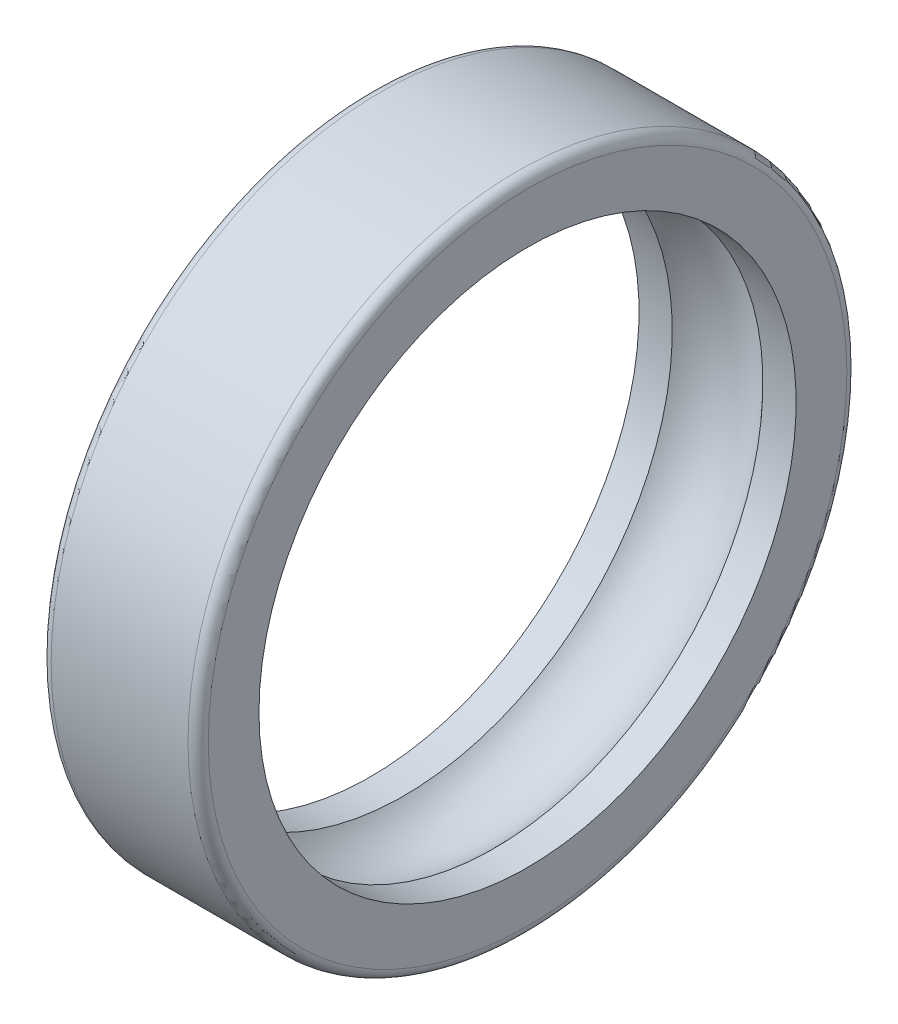
ISO-10303-21;
HEADER;
FILE_DESCRIPTION(('STEP AP214'),'2;1');
FILE_NAME('part.step','',(''),(''),'','','');
FILE_SCHEMA(('AUTOMOTIVE_DESIGN { 1 0 10303 214 1 1 1 1 }'));
ENDSEC;
DATA;
#1=APPLICATION_CONTEXT('core data for automotive mechanical design processes');
#2=APPLICATION_PROTOCOL_DEFINITION('international standard','automotive_design',2000,#1);
#3=PRODUCT_CONTEXT('',#1,'mechanical');
#4=PRODUCT('Part','Part','',(#3));
#5=PRODUCT_RELATED_PRODUCT_CATEGORY('part','',(#4));
#6=PRODUCT_DEFINITION_FORMATION('','',#4);
#7=PRODUCT_DEFINITION_CONTEXT('part definition',#1,'design');
#8=PRODUCT_DEFINITION('design','',#6,#7);
#9=PRODUCT_DEFINITION_SHAPE('','',#8);
#10=(LENGTH_UNIT() NAMED_UNIT(*) SI_UNIT(.MILLI.,.METRE.));
#11=(NAMED_UNIT(*) PLANE_ANGLE_UNIT() SI_UNIT($,.RADIAN.));
#12=(NAMED_UNIT(*) SI_UNIT($,.STERADIAN.) SOLID_ANGLE_UNIT());
#13=UNCERTAINTY_MEASURE_WITH_UNIT(LENGTH_MEASURE(1.E-05),#10,'distance_accuracy_value','');
#14=(GEOMETRIC_REPRESENTATION_CONTEXT(3) GLOBAL_UNCERTAINTY_ASSIGNED_CONTEXT((#13)) GLOBAL_UNIT_ASSIGNED_CONTEXT((#10,
#11,#12)) REPRESENTATION_CONTEXT('',''));
#15=CARTESIAN_POINT('',(0.,0.,0.));
#16=DIRECTION('',(0.,0.,1.));
#17=DIRECTION('',(1.,0.,0.));
#18=AXIS2_PLACEMENT_3D('',#15,#16,#17);
#19=CARTESIAN_POINT('',(15.5,65.,0.));
#20=DIRECTION('',(-1.,0.,0.));
#21=DIRECTION('',(0.,0.,1.));
#22=AXIS2_PLACEMENT_3D('',#19,#20,#21);
#23=PLANE('',#22);
#24=CARTESIAN_POINT('',(15.5,0.,0.));
#25=DIRECTION('',(-1.,0.,0.));
#26=DIRECTION('',(0.,0.,1.));
#27=AXIS2_PLACEMENT_3D('',#24,#25,#26);
#28=CIRCLE('',#27,63.);
#29=CARTESIAN_POINT('',(15.5,0.,63.));
#30=VERTEX_POINT('',#29);
#31=EDGE_CURVE('E10',#30,#30,#28,.F.);
#32=ORIENTED_EDGE('',*,*,#31,.T.);
#33=EDGE_LOOP('',(#32));
#34=FACE_BOUND('',#33,.T.);
#35=CARTESIAN_POINT('',(15.5,0.,0.));
#36=DIRECTION('',(-1.,0.,0.));
#37=DIRECTION('',(0.,0.,1.));
#38=AXIS2_PLACEMENT_3D('',#35,#36,#37);
#39=CIRCLE('',#38,53.);
#40=CARTESIAN_POINT('',(15.5,0.,53.));
#41=VERTEX_POINT('',#40);
#42=EDGE_CURVE('E53',#41,#41,#39,.T.);
#43=ORIENTED_EDGE('',*,*,#42,.T.);
#44=EDGE_LOOP('',(#43));
#45=FACE_BOUND('',#44,.T.);
#46=ADVANCED_FACE('F33',(#34,#45),#23,.F.);
#47=CARTESIAN_POINT('',(0.,0.,0.));
#48=DIRECTION('',(-1.,0.,0.));
#49=DIRECTION('',(0.,0.,1.));
#50=AXIS2_PLACEMENT_3D('',#47,#48,#49);
#51=CYLINDRICAL_SURFACE('',#50,53.);
#52=ORIENTED_EDGE('',*,*,#42,.F.);
#53=EDGE_LOOP('',(#52));
#54=FACE_BOUND('',#53,.T.);
#55=CARTESIAN_POINT('',(8.94427190999918,0.,0.));
#56=DIRECTION('',(-1.,0.,0.));
#57=DIRECTION('',(0.,0.,1.));
#58=AXIS2_PLACEMENT_3D('',#55,#56,#57);
#59=CIRCLE('',#58,53.);
#60=CARTESIAN_POINT('',(8.94427190999918,0.,53.));
#61=VERTEX_POINT('',#60);
#62=EDGE_CURVE('E56',#61,#61,#59,.T.);
#63=ORIENTED_EDGE('',*,*,#62,.T.);
#64=EDGE_LOOP('',(#63));
#65=FACE_BOUND('',#64,.T.);
#66=ADVANCED_FACE('F83',(#54,#65),#51,.F.);
#67=CARTESIAN_POINT('',(0.,0.,0.));
#68=DIRECTION('',(-1.,0.,0.));
#69=DIRECTION('',(0.,0.,1.));
#70=AXIS2_PLACEMENT_3D('',#67,#68,#69);
#71=TOROIDAL_SURFACE('',#70,45.,12.);
#72=ORIENTED_EDGE('',*,*,#62,.F.);
#73=EDGE_LOOP('',(#72));
#74=FACE_BOUND('',#73,.T.);
#75=CARTESIAN_POINT('',(-8.94427190999917,0.,0.));
#76=DIRECTION('',(-1.,0.,0.));
#77=DIRECTION('',(0.,0.,1.));
#78=AXIS2_PLACEMENT_3D('',#75,#76,#77);
#79=CIRCLE('',#78,53.);
#80=CARTESIAN_POINT('',(-8.94427190999917,0.,53.));
#81=VERTEX_POINT('',#80);
#82=EDGE_CURVE('E59',#81,#81,#79,.T.);
#83=ORIENTED_EDGE('',*,*,#82,.T.);
#84=EDGE_LOOP('',(#83));
#85=FACE_BOUND('',#84,.T.);
#86=ADVANCED_FACE('F79',(#74,#85),#71,.F.);
#87=CARTESIAN_POINT('',(0.,0.,0.));
#88=DIRECTION('',(-1.,0.,0.));
#89=DIRECTION('',(0.,0.,1.));
#90=AXIS2_PLACEMENT_3D('',#87,#88,#89);
#91=CYLINDRICAL_SURFACE('',#90,53.);
#92=ORIENTED_EDGE('',*,*,#82,.F.);
#93=EDGE_LOOP('',(#92));
#94=FACE_BOUND('',#93,.T.);
#95=CARTESIAN_POINT('',(-15.5,0.,0.));
#96=DIRECTION('',(-1.,0.,0.));
#97=DIRECTION('',(0.,0.,1.));
#98=AXIS2_PLACEMENT_3D('',#95,#96,#97);
#99=CIRCLE('',#98,53.);
#100=CARTESIAN_POINT('',(-15.5,0.,53.));
#101=VERTEX_POINT('',#100);
#102=EDGE_CURVE('E62',#101,#101,#99,.T.);
#103=ORIENTED_EDGE('',*,*,#102,.T.);
#104=EDGE_LOOP('',(#103));
#105=FACE_BOUND('',#104,.T.);
#106=ADVANCED_FACE('F66',(#94,#105),#91,.F.);
#107=CARTESIAN_POINT('',(-15.5,65.,0.));
#108=DIRECTION('',(1.,0.,0.));
#109=DIRECTION('',(0.,0.,-1.));
#110=AXIS2_PLACEMENT_3D('',#107,#108,#109);
#111=PLANE('',#110);
#112=CARTESIAN_POINT('',(-15.5,0.,0.));
#113=DIRECTION('',(1.,0.,0.));
#114=DIRECTION('',(0.,0.,-1.));
#115=AXIS2_PLACEMENT_3D('',#112,#113,#114);
#116=CIRCLE('',#115,63.);
#117=CARTESIAN_POINT('',(-15.5,0.,-63.));
#118=VERTEX_POINT('',#117);
#119=EDGE_CURVE('E48',#118,#118,#116,.F.);
#120=ORIENTED_EDGE('',*,*,#119,.T.);
#121=EDGE_LOOP('',(#120));
#122=FACE_BOUND('',#121,.T.);
#123=ORIENTED_EDGE('',*,*,#102,.F.);
#124=EDGE_LOOP('',(#123));
#125=FACE_BOUND('',#124,.T.);
#126=ADVANCED_FACE('F68',(#122,#125),#111,.F.);
#127=CARTESIAN_POINT('',(0.,0.,0.));
#128=DIRECTION('',(-1.,0.,0.));
#129=DIRECTION('',(0.,0.,1.));
#130=AXIS2_PLACEMENT_3D('',#127,#128,#129);
#131=CYLINDRICAL_SURFACE('',#130,65.);
#132=CARTESIAN_POINT('',(-13.5,0.,0.));
#133=DIRECTION('',(1.,0.,0.));
#134=DIRECTION('',(0.,0.,-1.));
#135=AXIS2_PLACEMENT_3D('',#132,#133,#134);
#136=CIRCLE('',#135,65.);
#137=CARTESIAN_POINT('',(-13.5,0.,-65.));
#138=VERTEX_POINT('',#137);
#139=EDGE_CURVE('E40',#138,#138,#136,.T.);
#140=ORIENTED_EDGE('',*,*,#139,.T.);
#141=EDGE_LOOP('',(#140));
#142=FACE_BOUND('',#141,.T.);
#143=CARTESIAN_POINT('',(13.5,0.,0.));
#144=DIRECTION('',(-1.,0.,0.));
#145=DIRECTION('',(0.,0.,1.));
#146=AXIS2_PLACEMENT_3D('',#143,#144,#145);
#147=CIRCLE('',#146,65.);
#148=CARTESIAN_POINT('',(13.5,0.,65.));
#149=VERTEX_POINT('',#148);
#150=EDGE_CURVE('E44',#149,#149,#147,.T.);
#151=ORIENTED_EDGE('',*,*,#150,.T.);
#152=EDGE_LOOP('',(#151));
#153=FACE_BOUND('',#152,.T.);
#154=ADVANCED_FACE('F70',(#142,#153),#131,.T.);
#155=CARTESIAN_POINT('',(-13.5,0.,0.));
#156=DIRECTION('',(1.,0.,0.));
#157=DIRECTION('',(0.,0.,-1.));
#158=AXIS2_PLACEMENT_3D('',#155,#156,#157);
#159=TOROIDAL_SURFACE('',#158,63.,2.);
#160=ORIENTED_EDGE('',*,*,#139,.F.);
#161=EDGE_LOOP('',(#160));
#162=FACE_BOUND('',#161,.T.);
#163=ORIENTED_EDGE('',*,*,#119,.F.);
#164=EDGE_LOOP('',(#163));
#165=FACE_BOUND('',#164,.T.);
#166=ADVANCED_FACE('F77',(#162,#165),#159,.T.);
#167=CARTESIAN_POINT('',(13.5,0.,0.));
#168=DIRECTION('',(-1.,0.,0.));
#169=DIRECTION('',(0.,0.,1.));
#170=AXIS2_PLACEMENT_3D('',#167,#168,#169);
#171=TOROIDAL_SURFACE('',#170,63.,2.);
#172=ORIENTED_EDGE('',*,*,#31,.F.);
#173=EDGE_LOOP('',(#172));
#174=FACE_BOUND('',#173,.T.);
#175=ORIENTED_EDGE('',*,*,#150,.F.);
#176=EDGE_LOOP('',(#175));
#177=FACE_BOUND('',#176,.T.);
#178=ADVANCED_FACE('F35',(#174,#177),#171,.T.);
#179=CLOSED_SHELL('',(#46,#66,#86,#106,#126,#154,#166,#178));
#180=MANIFOLD_SOLID_BREP('B2',#179);
#181=ADVANCED_BREP_SHAPE_REPRESENTATION('',(#18,#180),#14);
#182=SHAPE_DEFINITION_REPRESENTATION(#9,#181);
ENDSEC;
END-ISO-10303-21;
